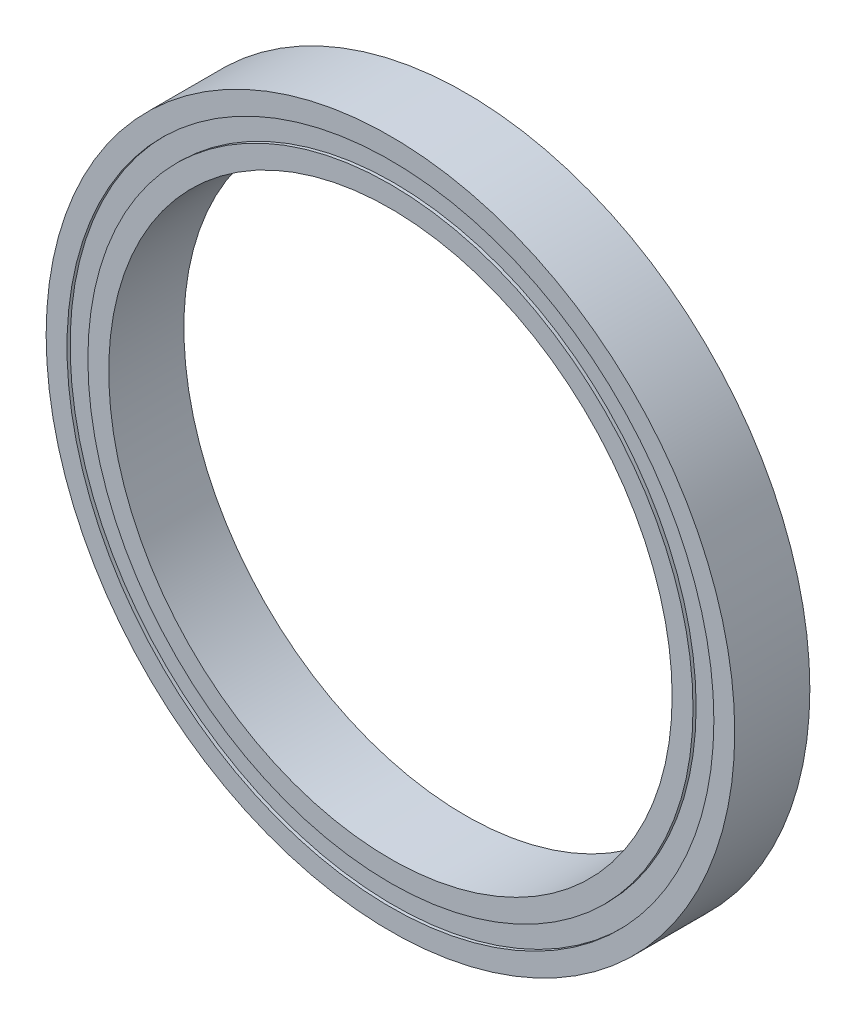
ISO-10303-21;
HEADER;
FILE_DESCRIPTION(('STEP AP214'),'2;1');
FILE_NAME('part.step','',(''),(''),'','','');
FILE_SCHEMA(('AUTOMOTIVE_DESIGN { 1 0 10303 214 1 1 1 1 }'));
ENDSEC;
DATA;
#1=APPLICATION_CONTEXT('core data for automotive mechanical design processes');
#2=APPLICATION_PROTOCOL_DEFINITION('international standard','automotive_design',2000,#1);
#3=PRODUCT_CONTEXT('',#1,'mechanical');
#4=PRODUCT('Part','Part','',(#3));
#5=PRODUCT_RELATED_PRODUCT_CATEGORY('part','',(#4));
#6=PRODUCT_DEFINITION_FORMATION('','',#4);
#7=PRODUCT_DEFINITION_CONTEXT('part definition',#1,'design');
#8=PRODUCT_DEFINITION('design','',#6,#7);
#9=PRODUCT_DEFINITION_SHAPE('','',#8);
#10=(LENGTH_UNIT() NAMED_UNIT(*) SI_UNIT(.MILLI.,.METRE.));
#11=(NAMED_UNIT(*) PLANE_ANGLE_UNIT() SI_UNIT($,.RADIAN.));
#12=(NAMED_UNIT(*) SI_UNIT($,.STERADIAN.) SOLID_ANGLE_UNIT());
#13=UNCERTAINTY_MEASURE_WITH_UNIT(LENGTH_MEASURE(1.E-05),#10,'distance_accuracy_value','');
#14=(GEOMETRIC_REPRESENTATION_CONTEXT(3) GLOBAL_UNCERTAINTY_ASSIGNED_CONTEXT((#13)) GLOBAL_UNIT_ASSIGNED_CONTEXT((#10,
#11,#12)) REPRESENTATION_CONTEXT('',''));
#15=CARTESIAN_POINT('',(0.,0.,0.));
#16=DIRECTION('',(0.,0.,1.));
#17=DIRECTION('',(1.,0.,0.));
#18=AXIS2_PLACEMENT_3D('',#15,#16,#17);
#19=CARTESIAN_POINT('',(0.,0.,3.));
#20=DIRECTION('',(0.,0.,-1.));
#21=DIRECTION('',(1.,0.,0.));
#22=AXIS2_PLACEMENT_3D('',#19,#20,#21);
#23=CYLINDRICAL_SURFACE('',#22,24.1666666666667);
#24=CARTESIAN_POINT('',(0.,0.,3.));
#25=DIRECTION('',(0.,0.,1.));
#26=DIRECTION('',(1.,0.,0.));
#27=AXIS2_PLACEMENT_3D('',#24,#25,#26);
#28=CIRCLE('',#27,24.1666666666667);
#29=CARTESIAN_POINT('',(24.1666666666667,0.,3.));
#30=VERTEX_POINT('',#29);
#31=EDGE_CURVE('E45',#30,#30,#28,.T.);
#32=ORIENTED_EDGE('',*,*,#31,.F.);
#33=EDGE_LOOP('',(#32));
#34=FACE_BOUND('',#33,.T.);
#35=CARTESIAN_POINT('',(0.,0.,2.75));
#36=DIRECTION('',(0.,0.,1.));
#37=DIRECTION('',(1.,0.,0.));
#38=AXIS2_PLACEMENT_3D('',#35,#36,#37);
#39=CIRCLE('',#38,24.1666666666667);
#40=CARTESIAN_POINT('',(24.1666666666667,0.,2.75));
#41=VERTEX_POINT('',#40);
#42=EDGE_CURVE('E64',#41,#41,#39,.T.);
#43=ORIENTED_EDGE('',*,*,#42,.T.);
#44=EDGE_LOOP('',(#43));
#45=FACE_BOUND('',#44,.T.);
#46=ADVANCED_FACE('F38',(#34,#45),#23,.T.);
#47=CARTESIAN_POINT('',(0.,0.,3.));
#48=DIRECTION('',(0.,0.,-1.));
#49=DIRECTION('',(1.,0.,0.));
#50=AXIS2_PLACEMENT_3D('',#47,#48,#49);
#51=CYLINDRICAL_SURFACE('',#50,22.5);
#52=CARTESIAN_POINT('',(0.,0.,3.));
#53=DIRECTION('',(0.,0.,1.));
#54=DIRECTION('',(1.,0.,0.));
#55=AXIS2_PLACEMENT_3D('',#52,#53,#54);
#56=CIRCLE('',#55,22.5);
#57=CARTESIAN_POINT('',(22.5,0.,3.));
#58=VERTEX_POINT('',#57);
#59=EDGE_CURVE('E49',#58,#58,#56,.T.);
#60=ORIENTED_EDGE('',*,*,#59,.T.);
#61=EDGE_LOOP('',(#60));
#62=FACE_BOUND('',#61,.T.);
#63=CARTESIAN_POINT('',(0.,0.,-3.));
#64=DIRECTION('',(0.,0.,1.));
#65=DIRECTION('',(1.,0.,0.));
#66=AXIS2_PLACEMENT_3D('',#63,#64,#65);
#67=CIRCLE('',#66,22.5);
#68=CARTESIAN_POINT('',(22.5,0.,-3.));
#69=VERTEX_POINT('',#68);
#70=EDGE_CURVE('E58',#69,#69,#67,.T.);
#71=ORIENTED_EDGE('',*,*,#70,.F.);
#72=EDGE_LOOP('',(#71));
#73=FACE_BOUND('',#72,.T.);
#74=ADVANCED_FACE('F40',(#62,#73),#51,.F.);
#75=CARTESIAN_POINT('',(0.,0.,-2.75));
#76=DIRECTION('',(0.,0.,1.));
#77=DIRECTION('',(1.,0.,0.));
#78=AXIS2_PLACEMENT_3D('',#75,#76,#77);
#79=CIRCLE('',#78,24.1666666666667);
#80=CARTESIAN_POINT('',(24.1666666666667,0.,-2.75));
#81=VERTEX_POINT('',#80);
#82=EDGE_CURVE('E10',#81,#81,#79,.F.);
#83=ORIENTED_EDGE('',*,*,#82,.T.);
#84=EDGE_LOOP('',(#83));
#85=FACE_BOUND('',#84,.T.);
#86=CARTESIAN_POINT('',(0.,0.,-3.));
#87=DIRECTION('',(0.,0.,1.));
#88=DIRECTION('',(1.,0.,0.));
#89=AXIS2_PLACEMENT_3D('',#86,#87,#88);
#90=CIRCLE('',#89,24.1666666666667);
#91=CARTESIAN_POINT('',(24.1666666666667,0.,-3.));
#92=VERTEX_POINT('',#91);
#93=EDGE_CURVE('E53',#92,#92,#90,.T.);
#94=ORIENTED_EDGE('',*,*,#93,.T.);
#95=EDGE_LOOP('',(#94));
#96=FACE_BOUND('',#95,.T.);
#97=ADVANCED_FACE('F104',(#85,#96),#23,.T.);
#98=CARTESIAN_POINT('',(0.,0.,3.));
#99=DIRECTION('',(0.,0.,-1.));
#100=DIRECTION('',(1.,0.,0.));
#101=AXIS2_PLACEMENT_3D('',#98,#99,#100);
#102=PLANE('',#101);
#103=ORIENTED_EDGE('',*,*,#59,.F.);
#104=EDGE_LOOP('',(#103));
#105=FACE_BOUND('',#104,.T.);
#106=ORIENTED_EDGE('',*,*,#31,.T.);
#107=EDGE_LOOP('',(#106));
#108=FACE_BOUND('',#107,.T.);
#109=ADVANCED_FACE('F112',(#105,#108),#102,.F.);
#110=CARTESIAN_POINT('',(0.,0.,-3.));
#111=DIRECTION('',(0.,0.,-1.));
#112=DIRECTION('',(1.,0.,0.));
#113=AXIS2_PLACEMENT_3D('',#110,#111,#112);
#114=PLANE('',#113);
#115=ORIENTED_EDGE('',*,*,#70,.T.);
#116=EDGE_LOOP('',(#115));
#117=FACE_BOUND('',#116,.T.);
#118=ORIENTED_EDGE('',*,*,#93,.F.);
#119=EDGE_LOOP('',(#118));
#120=FACE_BOUND('',#119,.T.);
#121=ADVANCED_FACE('F116',(#117,#120),#114,.T.);
#122=CARTESIAN_POINT('',(0.,0.,2.75));
#123=DIRECTION('',(0.,0.,-1.));
#124=DIRECTION('',(1.,0.,0.));
#125=AXIS2_PLACEMENT_3D('',#122,#123,#124);
#126=PLANE('',#125);
#127=ORIENTED_EDGE('',*,*,#42,.F.);
#128=EDGE_LOOP('',(#127));
#129=FACE_BOUND('',#128,.T.);
#130=CARTESIAN_POINT('',(0.,0.,2.75));
#131=DIRECTION('',(0.,0.,1.));
#132=DIRECTION('',(1.,0.,0.));
#133=AXIS2_PLACEMENT_3D('',#130,#131,#132);
#134=CIRCLE('',#133,25.8333333333333);
#135=CARTESIAN_POINT('',(25.8333333333333,0.,2.75));
#136=VERTEX_POINT('',#135);
#137=EDGE_CURVE('E61',#136,#136,#134,.T.);
#138=ORIENTED_EDGE('',*,*,#137,.T.);
#139=EDGE_LOOP('',(#138));
#140=FACE_BOUND('',#139,.T.);
#141=ADVANCED_FACE('F122',(#129,#140),#126,.F.);
#142=CARTESIAN_POINT('',(0.,0.,-2.75));
#143=DIRECTION('',(0.,0.,-1.));
#144=DIRECTION('',(1.,0.,0.));
#145=AXIS2_PLACEMENT_3D('',#142,#143,#144);
#146=PLANE('',#145);
#147=ORIENTED_EDGE('',*,*,#82,.F.);
#148=EDGE_LOOP('',(#147));
#149=FACE_BOUND('',#148,.T.);
#150=CARTESIAN_POINT('',(0.,0.,-2.75));
#151=DIRECTION('',(0.,0.,1.));
#152=DIRECTION('',(1.,0.,0.));
#153=AXIS2_PLACEMENT_3D('',#150,#151,#152);
#154=CIRCLE('',#153,25.8333333333333);
#155=CARTESIAN_POINT('',(25.8333333333333,0.,-2.75));
#156=VERTEX_POINT('',#155);
#157=EDGE_CURVE('E67',#156,#156,#154,.T.);
#158=ORIENTED_EDGE('',*,*,#157,.F.);
#159=EDGE_LOOP('',(#158));
#160=FACE_BOUND('',#159,.T.);
#161=ADVANCED_FACE('F99',(#149,#160),#146,.T.);
#162=CARTESIAN_POINT('',(0.,0.,3.));
#163=DIRECTION('',(0.,0.,-1.));
#164=DIRECTION('',(1.,0.,0.));
#165=AXIS2_PLACEMENT_3D('',#162,#163,#164);
#166=CYLINDRICAL_SURFACE('',#165,25.8333333333333);
#167=CARTESIAN_POINT('',(0.,0.,3.));
#168=DIRECTION('',(0.,0.,1.));
#169=DIRECTION('',(1.,0.,0.));
#170=AXIS2_PLACEMENT_3D('',#167,#168,#169);
#171=CIRCLE('',#170,25.8333333333333);
#172=CARTESIAN_POINT('',(25.8333333333333,0.,3.));
#173=VERTEX_POINT('',#172);
#174=EDGE_CURVE('E73',#173,#173,#171,.T.);
#175=ORIENTED_EDGE('',*,*,#174,.T.);
#176=EDGE_LOOP('',(#175));
#177=FACE_BOUND('',#176,.T.);
#178=ORIENTED_EDGE('',*,*,#137,.F.);
#179=EDGE_LOOP('',(#178));
#180=FACE_BOUND('',#179,.T.);
#181=ADVANCED_FACE('F89',(#177,#180),#166,.F.);
#182=ORIENTED_EDGE('',*,*,#157,.T.);
#183=EDGE_LOOP('',(#182));
#184=FACE_BOUND('',#183,.T.);
#185=CARTESIAN_POINT('',(0.,0.,-3.));
#186=DIRECTION('',(0.,0.,1.));
#187=DIRECTION('',(1.,0.,0.));
#188=AXIS2_PLACEMENT_3D('',#185,#186,#187);
#189=CIRCLE('',#188,25.8333333333333);
#190=CARTESIAN_POINT('',(25.8333333333333,0.,-3.));
#191=VERTEX_POINT('',#190);
#192=EDGE_CURVE('E79',#191,#191,#189,.T.);
#193=ORIENTED_EDGE('',*,*,#192,.F.);
#194=EDGE_LOOP('',(#193));
#195=FACE_BOUND('',#194,.T.);
#196=ADVANCED_FACE('F86',(#184,#195),#166,.F.);
#197=CARTESIAN_POINT('',(0.,0.,3.));
#198=DIRECTION('',(0.,0.,-1.));
#199=DIRECTION('',(1.,0.,0.));
#200=AXIS2_PLACEMENT_3D('',#197,#198,#199);
#201=CYLINDRICAL_SURFACE('',#200,27.5);
#202=CARTESIAN_POINT('',(0.,0.,3.));
#203=DIRECTION('',(0.,0.,1.));
#204=DIRECTION('',(1.,0.,0.));
#205=AXIS2_PLACEMENT_3D('',#202,#203,#204);
#206=CIRCLE('',#205,27.5);
#207=CARTESIAN_POINT('',(27.5,0.,3.));
#208=VERTEX_POINT('',#207);
#209=EDGE_CURVE('E70',#208,#208,#206,.T.);
#210=ORIENTED_EDGE('',*,*,#209,.F.);
#211=EDGE_LOOP('',(#210));
#212=FACE_BOUND('',#211,.T.);
#213=CARTESIAN_POINT('',(0.,0.,-3.));
#214=DIRECTION('',(0.,0.,1.));
#215=DIRECTION('',(1.,0.,0.));
#216=AXIS2_PLACEMENT_3D('',#213,#214,#215);
#217=CIRCLE('',#216,27.5);
#218=CARTESIAN_POINT('',(27.5,0.,-3.));
#219=VERTEX_POINT('',#218);
#220=EDGE_CURVE('E76',#219,#219,#217,.T.);
#221=ORIENTED_EDGE('',*,*,#220,.T.);
#222=EDGE_LOOP('',(#221));
#223=FACE_BOUND('',#222,.T.);
#224=ADVANCED_FACE('F88',(#212,#223),#201,.T.);
#225=CARTESIAN_POINT('',(0.,0.,3.));
#226=DIRECTION('',(0.,0.,-1.));
#227=DIRECTION('',(1.,0.,0.));
#228=AXIS2_PLACEMENT_3D('',#225,#226,#227);
#229=PLANE('',#228);
#230=ORIENTED_EDGE('',*,*,#174,.F.);
#231=EDGE_LOOP('',(#230));
#232=FACE_BOUND('',#231,.T.);
#233=ORIENTED_EDGE('',*,*,#209,.T.);
#234=EDGE_LOOP('',(#233));
#235=FACE_BOUND('',#234,.T.);
#236=ADVANCED_FACE('F96',(#232,#235),#229,.F.);
#237=CARTESIAN_POINT('',(0.,0.,-3.));
#238=DIRECTION('',(0.,0.,-1.));
#239=DIRECTION('',(1.,0.,0.));
#240=AXIS2_PLACEMENT_3D('',#237,#238,#239);
#241=PLANE('',#240);
#242=ORIENTED_EDGE('',*,*,#192,.T.);
#243=EDGE_LOOP('',(#242));
#244=FACE_BOUND('',#243,.T.);
#245=ORIENTED_EDGE('',*,*,#220,.F.);
#246=EDGE_LOOP('',(#245));
#247=FACE_BOUND('',#246,.T.);
#248=ADVANCED_FACE('F83',(#244,#247),#241,.T.);
#249=CLOSED_SHELL('',(#46,#74,#97,#109,#121,#141,#161,#181,#196,#224,#236,#248));
#250=MANIFOLD_SOLID_BREP('B2',#249);
#251=ADVANCED_BREP_SHAPE_REPRESENTATION('',(#18,#250),#14);
#252=SHAPE_DEFINITION_REPRESENTATION(#9,#251);
ENDSEC;
END-ISO-10303-21;
